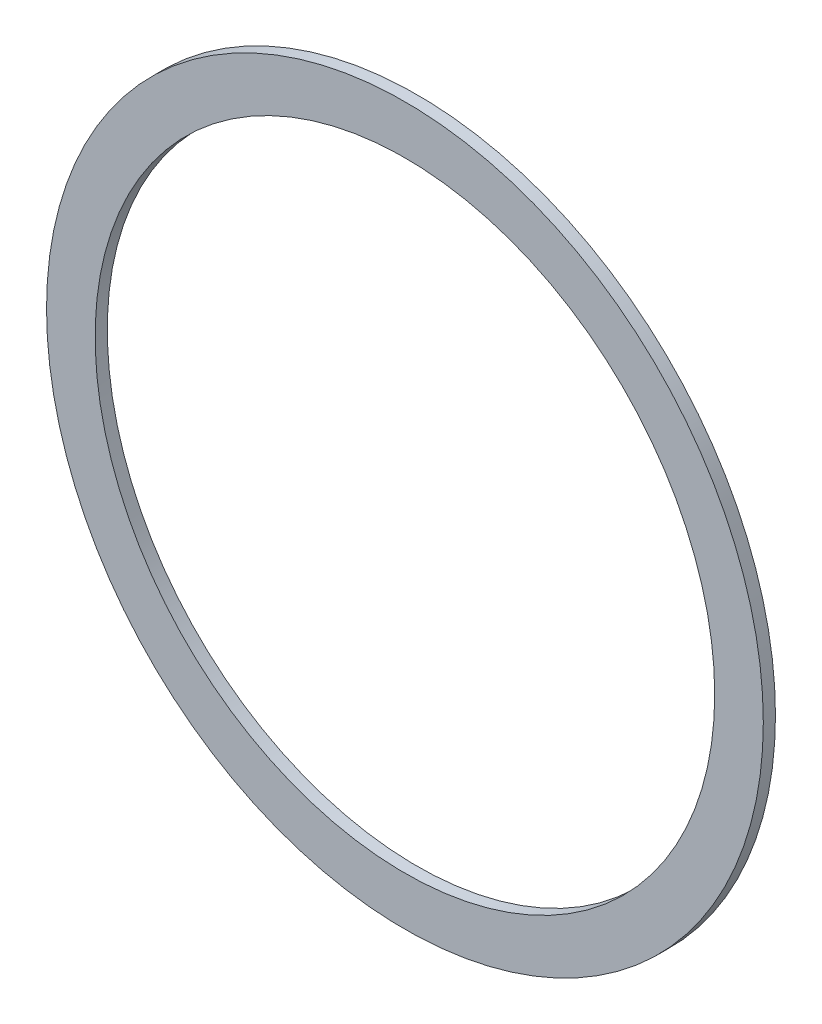
ISO-10303-21;
HEADER;
FILE_DESCRIPTION(('STEP AP214'),'2;1');
FILE_NAME('part.step','',(''),(''),'','','');
FILE_SCHEMA(('AUTOMOTIVE_DESIGN { 1 0 10303 214 1 1 1 1 }'));
ENDSEC;
DATA;
#1=APPLICATION_CONTEXT('core data for automotive mechanical design processes');
#2=APPLICATION_PROTOCOL_DEFINITION('international standard','automotive_design',2000,#1);
#3=PRODUCT_CONTEXT('',#1,'mechanical');
#4=PRODUCT('Part','Part','',(#3));
#5=PRODUCT_RELATED_PRODUCT_CATEGORY('part','',(#4));
#6=PRODUCT_DEFINITION_FORMATION('','',#4);
#7=PRODUCT_DEFINITION_CONTEXT('part definition',#1,'design');
#8=PRODUCT_DEFINITION('design','',#6,#7);
#9=PRODUCT_DEFINITION_SHAPE('','',#8);
#10=(LENGTH_UNIT() NAMED_UNIT(*) SI_UNIT(.MILLI.,.METRE.));
#11=(NAMED_UNIT(*) PLANE_ANGLE_UNIT() SI_UNIT($,.RADIAN.));
#12=(NAMED_UNIT(*) SI_UNIT($,.STERADIAN.) SOLID_ANGLE_UNIT());
#13=UNCERTAINTY_MEASURE_WITH_UNIT(LENGTH_MEASURE(1.E-05),#10,'distance_accuracy_value','');
#14=(GEOMETRIC_REPRESENTATION_CONTEXT(3) GLOBAL_UNCERTAINTY_ASSIGNED_CONTEXT((#13)) GLOBAL_UNIT_ASSIGNED_CONTEXT((#10,
#11,#12)) REPRESENTATION_CONTEXT('',''));
#15=CARTESIAN_POINT('',(0.,0.,0.));
#16=DIRECTION('',(0.,0.,1.));
#17=DIRECTION('',(1.,0.,0.));
#18=AXIS2_PLACEMENT_3D('',#15,#16,#17);
#19=CARTESIAN_POINT('',(0.,0.,5.));
#20=DIRECTION('',(0.,0.,1.));
#21=DIRECTION('',(1.,0.,0.));
#22=AXIS2_PLACEMENT_3D('',#19,#20,#21);
#23=PLANE('',#22);
#24=CARTESIAN_POINT('',(0.,0.,5.));
#25=DIRECTION('',(0.,0.,1.));
#26=DIRECTION('',(1.,0.,0.));
#27=AXIS2_PLACEMENT_3D('',#24,#25,#26);
#28=CIRCLE('',#27,295.);
#29=CARTESIAN_POINT('',(295.,0.,5.));
#30=VERTEX_POINT('',#29);
#31=EDGE_CURVE('E10',#30,#30,#28,.T.);
#32=ORIENTED_EDGE('',*,*,#31,.T.);
#33=EDGE_LOOP('',(#32));
#34=FACE_BOUND('',#33,.T.);
#35=CARTESIAN_POINT('',(0.,0.,5.));
#36=DIRECTION('',(0.,0.,1.));
#37=DIRECTION('',(1.,0.,0.));
#38=AXIS2_PLACEMENT_3D('',#35,#36,#37);
#39=CIRCLE('',#38,255.);
#40=CARTESIAN_POINT('',(255.,0.,5.));
#41=VERTEX_POINT('',#40);
#42=EDGE_CURVE('E48',#41,#41,#39,.T.);
#43=ORIENTED_EDGE('',*,*,#42,.F.);
#44=EDGE_LOOP('',(#43));
#45=FACE_BOUND('',#44,.T.);
#46=ADVANCED_FACE('F35',(#34,#45),#23,.T.);
#47=CARTESIAN_POINT('',(0.,0.,-5.));
#48=DIRECTION('',(0.,0.,1.));
#49=DIRECTION('',(1.,0.,0.));
#50=AXIS2_PLACEMENT_3D('',#47,#48,#49);
#51=PLANE('',#50);
#52=CARTESIAN_POINT('',(0.,0.,-5.));
#53=DIRECTION('',(0.,0.,1.));
#54=DIRECTION('',(1.,0.,0.));
#55=AXIS2_PLACEMENT_3D('',#52,#53,#54);
#56=CIRCLE('',#55,295.);
#57=CARTESIAN_POINT('',(295.,0.,-5.));
#58=VERTEX_POINT('',#57);
#59=EDGE_CURVE('E39',#58,#58,#56,.T.);
#60=ORIENTED_EDGE('',*,*,#59,.F.);
#61=EDGE_LOOP('',(#60));
#62=FACE_BOUND('',#61,.T.);
#63=CARTESIAN_POINT('',(0.,0.,-5.));
#64=DIRECTION('',(0.,0.,1.));
#65=DIRECTION('',(1.,0.,0.));
#66=AXIS2_PLACEMENT_3D('',#63,#64,#65);
#67=CIRCLE('',#66,255.);
#68=CARTESIAN_POINT('',(255.,0.,-5.));
#69=VERTEX_POINT('',#68);
#70=EDGE_CURVE('E50',#69,#69,#67,.T.);
#71=ORIENTED_EDGE('',*,*,#70,.T.);
#72=EDGE_LOOP('',(#71));
#73=FACE_BOUND('',#72,.T.);
#74=ADVANCED_FACE('F62',(#62,#73),#51,.F.);
#75=CARTESIAN_POINT('',(0.,0.,5.));
#76=DIRECTION('',(0.,0.,-1.));
#77=DIRECTION('',(-1.,0.,0.));
#78=AXIS2_PLACEMENT_3D('',#75,#76,#77);
#79=CYLINDRICAL_SURFACE('',#78,295.);
#80=ORIENTED_EDGE('',*,*,#31,.F.);
#81=EDGE_LOOP('',(#80));
#82=FACE_BOUND('',#81,.T.);
#83=ORIENTED_EDGE('',*,*,#59,.T.);
#84=EDGE_LOOP('',(#83));
#85=FACE_BOUND('',#84,.T.);
#86=ADVANCED_FACE('F37',(#82,#85),#79,.T.);
#87=CARTESIAN_POINT('',(0.,0.,5.));
#88=DIRECTION('',(0.,0.,-1.));
#89=DIRECTION('',(-1.,0.,0.));
#90=AXIS2_PLACEMENT_3D('',#87,#88,#89);
#91=CYLINDRICAL_SURFACE('',#90,255.);
#92=ORIENTED_EDGE('',*,*,#42,.T.);
#93=EDGE_LOOP('',(#92));
#94=FACE_BOUND('',#93,.T.);
#95=ORIENTED_EDGE('',*,*,#70,.F.);
#96=EDGE_LOOP('',(#95));
#97=FACE_BOUND('',#96,.T.);
#98=ADVANCED_FACE('F58',(#94,#97),#91,.F.);
#99=CLOSED_SHELL('',(#46,#74,#86,#98));
#100=MANIFOLD_SOLID_BREP('B2',#99);
#101=ADVANCED_BREP_SHAPE_REPRESENTATION('',(#18,#100),#14);
#102=SHAPE_DEFINITION_REPRESENTATION(#9,#101);
ENDSEC;
END-ISO-10303-21;
